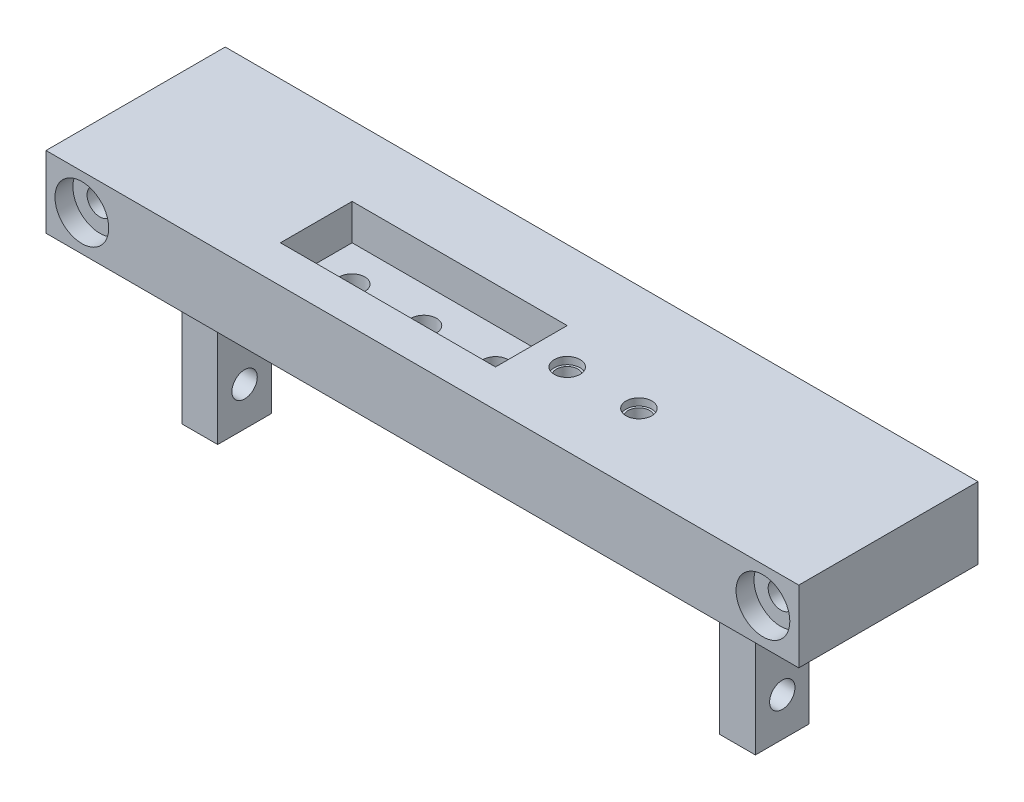
ISO-10303-21;
HEADER;
FILE_DESCRIPTION(('STEP AP214'),'2;1');
FILE_NAME('part.step','',(''),(''),'','','');
FILE_SCHEMA(('AUTOMOTIVE_DESIGN { 1 0 10303 214 1 1 1 1 }'));
ENDSEC;
DATA;
#1=APPLICATION_CONTEXT('core data for automotive mechanical design processes');
#2=APPLICATION_PROTOCOL_DEFINITION('international standard','automotive_design',2000,#1);
#3=PRODUCT_CONTEXT('',#1,'mechanical');
#4=PRODUCT('Part','Part','',(#3));
#5=PRODUCT_RELATED_PRODUCT_CATEGORY('part','',(#4));
#6=PRODUCT_DEFINITION_FORMATION('','',#4);
#7=PRODUCT_DEFINITION_CONTEXT('part definition',#1,'design');
#8=PRODUCT_DEFINITION('design','',#6,#7);
#9=PRODUCT_DEFINITION_SHAPE('','',#8);
#10=(LENGTH_UNIT() NAMED_UNIT(*) SI_UNIT(.MILLI.,.METRE.));
#11=(NAMED_UNIT(*) PLANE_ANGLE_UNIT() SI_UNIT($,.RADIAN.));
#12=(NAMED_UNIT(*) SI_UNIT($,.STERADIAN.) SOLID_ANGLE_UNIT());
#13=UNCERTAINTY_MEASURE_WITH_UNIT(LENGTH_MEASURE(1.E-05),#10,'distance_accuracy_value','');
#14=(GEOMETRIC_REPRESENTATION_CONTEXT(3) GLOBAL_UNCERTAINTY_ASSIGNED_CONTEXT((#13)) GLOBAL_UNIT_ASSIGNED_CONTEXT((#10,
#11,#12)) REPRESENTATION_CONTEXT('',''));
#15=CARTESIAN_POINT('',(0.,0.,0.));
#16=DIRECTION('',(0.,0.,1.));
#17=DIRECTION('',(1.,0.,0.));
#18=AXIS2_PLACEMENT_3D('',#15,#16,#17);
#19=CARTESIAN_POINT('',(66.675,12.7,-12.954));
#20=DIRECTION('',(0.,1.,0.));
#21=DIRECTION('',(0.,0.,1.));
#22=AXIS2_PLACEMENT_3D('',#19,#20,#21);
#23=CYLINDRICAL_SURFACE('',#22,2.24789999999999);
#24=CARTESIAN_POINT('',(66.675,0.,-12.954));
#25=DIRECTION('',(0.,1.,0.));
#26=DIRECTION('',(0.,0.,1.));
#27=AXIS2_PLACEMENT_3D('',#24,#25,#26);
#28=CIRCLE('',#27,2.2479);
#29=CARTESIAN_POINT('',(66.675,0.,-10.7061));
#30=VERTEX_POINT('',#29);
#31=EDGE_CURVE('E302',#30,#30,#28,.T.);
#32=ORIENTED_EDGE('',*,*,#31,.F.);
#33=EDGE_LOOP('',(#32));
#34=FACE_BOUND('',#33,.T.);
#35=CARTESIAN_POINT('',(66.675,6.35,-12.954));
#36=DIRECTION('',(0.,1.,0.));
#37=DIRECTION('',(0.,0.,1.));
#38=AXIS2_PLACEMENT_3D('',#35,#36,#37);
#39=CIRCLE('',#38,2.24789999999998);
#40=CARTESIAN_POINT('',(66.675,6.35,-10.7061));
#41=VERTEX_POINT('',#40);
#42=EDGE_CURVE('E169',#41,#41,#39,.F.);
#43=ORIENTED_EDGE('',*,*,#42,.F.);
#44=EDGE_LOOP('',(#43));
#45=FACE_BOUND('',#44,.T.);
#46=ADVANCED_FACE('F33',(#34,#45),#23,.F.);
#47=CARTESIAN_POINT('',(92.075,0.,-12.954));
#48=DIRECTION('',(0.,-1.,0.));
#49=DIRECTION('',(0.,0.,-1.));
#50=AXIS2_PLACEMENT_3D('',#47,#48,#49);
#51=CYLINDRICAL_SURFACE('',#50,1.89865);
#52=CARTESIAN_POINT('',(92.075,6.35,-12.954));
#53=DIRECTION('',(0.,-1.,0.));
#54=DIRECTION('',(0.,0.,-1.));
#55=AXIS2_PLACEMENT_3D('',#52,#53,#54);
#56=CIRCLE('',#55,1.89865);
#57=CARTESIAN_POINT('',(92.075,6.35,-14.85265));
#58=VERTEX_POINT('',#57);
#59=EDGE_CURVE('E221',#58,#58,#56,.T.);
#60=ORIENTED_EDGE('',*,*,#59,.T.);
#61=EDGE_LOOP('',(#60));
#62=FACE_BOUND('',#61,.T.);
#63=CARTESIAN_POINT('',(92.075,11.43,-12.954));
#64=DIRECTION('',(0.,1.,0.));
#65=DIRECTION('',(0.,0.,1.));
#66=AXIS2_PLACEMENT_3D('',#63,#64,#65);
#67=CIRCLE('',#66,1.89865);
#68=CARTESIAN_POINT('',(92.075,11.43,-11.05535));
#69=VERTEX_POINT('',#68);
#70=EDGE_CURVE('E209',#69,#69,#67,.F.);
#71=ORIENTED_EDGE('',*,*,#70,.F.);
#72=EDGE_LOOP('',(#71));
#73=FACE_BOUND('',#72,.T.);
#74=ADVANCED_FACE('F363',(#62,#73),#51,.F.);
#75=CARTESIAN_POINT('',(79.375,0.,-12.954));
#76=DIRECTION('',(0.,-1.,0.));
#77=DIRECTION('',(0.,0.,-1.));
#78=AXIS2_PLACEMENT_3D('',#75,#76,#77);
#79=CYLINDRICAL_SURFACE('',#78,1.89865);
#80=CARTESIAN_POINT('',(79.375,6.35,-12.954));
#81=DIRECTION('',(0.,-1.,0.));
#82=DIRECTION('',(0.,0.,-1.));
#83=AXIS2_PLACEMENT_3D('',#80,#81,#82);
#84=CIRCLE('',#83,1.89865);
#85=CARTESIAN_POINT('',(79.375,6.35,-14.85265));
#86=VERTEX_POINT('',#85);
#87=EDGE_CURVE('E212',#86,#86,#84,.T.);
#88=ORIENTED_EDGE('',*,*,#87,.T.);
#89=EDGE_LOOP('',(#88));
#90=FACE_BOUND('',#89,.T.);
#91=CARTESIAN_POINT('',(79.375,11.43,-12.954));
#92=DIRECTION('',(0.,1.,0.));
#93=DIRECTION('',(0.,0.,1.));
#94=AXIS2_PLACEMENT_3D('',#91,#92,#93);
#95=CIRCLE('',#94,1.89865);
#96=CARTESIAN_POINT('',(79.375,11.43,-11.05535));
#97=VERTEX_POINT('',#96);
#98=EDGE_CURVE('E196',#97,#97,#95,.F.);
#99=ORIENTED_EDGE('',*,*,#98,.F.);
#100=EDGE_LOOP('',(#99));
#101=FACE_BOUND('',#100,.T.);
#102=ADVANCED_FACE('F365',(#90,#101),#79,.F.);
#103=CARTESIAN_POINT('',(0.,0.,0.));
#104=DIRECTION('',(0.,-1.,0.));
#105=DIRECTION('',(0.,0.,-1.));
#106=AXIS2_PLACEMENT_3D('',#103,#104,#105);
#107=PLANE('',#106);
#108=CARTESIAN_POINT('',(53.975,0.,-12.954));
#109=DIRECTION('',(0.,-1.,0.));
#110=DIRECTION('',(0.,0.,-1.));
#111=AXIS2_PLACEMENT_3D('',#108,#109,#110);
#112=CIRCLE('',#111,2.2479);
#113=CARTESIAN_POINT('',(53.975,0.,-15.2019));
#114=VERTEX_POINT('',#113);
#115=EDGE_CURVE('E37',#114,#114,#112,.T.);
#116=ORIENTED_EDGE('',*,*,#115,.F.);
#117=EDGE_LOOP('',(#116));
#118=FACE_BOUND('',#117,.T.);
#119=CARTESIAN_POINT('',(41.275,0.,-12.954));
#120=DIRECTION('',(0.,-1.,0.));
#121=DIRECTION('',(0.,0.,-1.));
#122=AXIS2_PLACEMENT_3D('',#119,#120,#121);
#123=CIRCLE('',#122,2.2479);
#124=CARTESIAN_POINT('',(41.275,0.,-15.2019));
#125=VERTEX_POINT('',#124);
#126=EDGE_CURVE('E180',#125,#125,#123,.T.);
#127=ORIENTED_EDGE('',*,*,#126,.F.);
#128=EDGE_LOOP('',(#127));
#129=FACE_BOUND('',#128,.T.);
#130=CARTESIAN_POINT('',(79.375,0.,-12.954));
#131=DIRECTION('',(0.,-1.,0.));
#132=DIRECTION('',(0.,0.,-1.));
#133=AXIS2_PLACEMENT_3D('',#130,#131,#132);
#134=CIRCLE('',#133,3.96874999999999);
#135=CARTESIAN_POINT('',(79.375,0.,-16.92275));
#136=VERTEX_POINT('',#135);
#137=EDGE_CURVE('E205',#136,#136,#134,.T.);
#138=ORIENTED_EDGE('',*,*,#137,.F.);
#139=EDGE_LOOP('',(#138));
#140=FACE_BOUND('',#139,.T.);
#141=CARTESIAN_POINT('',(92.075,0.,-12.954));
#142=DIRECTION('',(0.,-1.,0.));
#143=DIRECTION('',(0.,0.,-1.));
#144=AXIS2_PLACEMENT_3D('',#141,#142,#143);
#145=CIRCLE('',#144,3.96875000000001);
#146=CARTESIAN_POINT('',(92.075,0.,-16.92275));
#147=VERTEX_POINT('',#146);
#148=EDGE_CURVE('E215',#147,#147,#145,.T.);
#149=ORIENTED_EDGE('',*,*,#148,.F.);
#150=EDGE_LOOP('',(#149));
#151=FACE_BOUND('',#150,.T.);
#152=ORIENTED_EDGE('',*,*,#31,.T.);
#153=EDGE_LOOP('',(#152));
#154=FACE_BOUND('',#153,.T.);
#155=DIRECTION('',(0.,0.,1.));
#156=VECTOR('',#155,1.);
#157=CARTESIAN_POINT('',(0.,0.,0.));
#158=LINE('',#157,#156);
#159=CARTESIAN_POINT('',(0.,0.,-31.75));
#160=VERTEX_POINT('',#159);
#161=CARTESIAN_POINT('',(0.,0.,0.));
#162=VERTEX_POINT('',#161);
#163=EDGE_CURVE('E329',#160,#162,#158,.T.);
#164=ORIENTED_EDGE('',*,*,#163,.F.);
#165=DIRECTION('',(-1.,0.,0.));
#166=VECTOR('',#165,1.);
#167=CARTESIAN_POINT('',(0.,0.,-31.75));
#168=LINE('',#167,#166);
#169=CARTESIAN_POINT('',(133.35,0.,-31.75));
#170=VERTEX_POINT('',#169);
#171=EDGE_CURVE('E334',#170,#160,#168,.T.);
#172=ORIENTED_EDGE('',*,*,#171,.F.);
#173=DIRECTION('',(0.,0.,-1.));
#174=VECTOR('',#173,1.);
#175=CARTESIAN_POINT('',(133.35,0.,0.));
#176=LINE('',#175,#174);
#177=CARTESIAN_POINT('',(133.35,0.,0.));
#178=VERTEX_POINT('',#177);
#179=EDGE_CURVE('E345',#178,#170,#176,.T.);
#180=ORIENTED_EDGE('',*,*,#179,.F.);
#181=DIRECTION('',(1.,0.,0.));
#182=VECTOR('',#181,1.);
#183=CARTESIAN_POINT('',(0.,0.,0.));
#184=LINE('',#183,#182);
#185=EDGE_CURVE('E343',#162,#178,#184,.T.);
#186=ORIENTED_EDGE('',*,*,#185,.F.);
#187=EDGE_LOOP('',(#164,#172,#180,#186));
#188=FACE_BOUND('',#187,.T.);
#189=DIRECTION('',(1.,0.,0.));
#190=VECTOR('',#189,1.);
#191=CARTESIAN_POINT('',(111.125,0.,-17.7165));
#192=LINE('',#191,#190);
#193=CARTESIAN_POINT('',(111.125,0.,-17.7165));
#194=VERTEX_POINT('',#193);
#195=CARTESIAN_POINT('',(117.475,0.,-17.7165));
#196=VERTEX_POINT('',#195);
#197=EDGE_CURVE('E287',#194,#196,#192,.T.);
#198=ORIENTED_EDGE('',*,*,#197,.F.);
#199=DIRECTION('',(0.,0.,-1.));
#200=VECTOR('',#199,1.);
#201=CARTESIAN_POINT('',(111.125,0.,-8.1915));
#202=LINE('',#201,#200);
#203=CARTESIAN_POINT('',(111.125,0.,-8.1915));
#204=VERTEX_POINT('',#203);
#205=EDGE_CURVE('E273',#204,#194,#202,.T.);
#206=ORIENTED_EDGE('',*,*,#205,.F.);
#207=DIRECTION('',(-1.,0.,0.));
#208=VECTOR('',#207,1.);
#209=CARTESIAN_POINT('',(111.125,0.,-8.1915));
#210=LINE('',#209,#208);
#211=CARTESIAN_POINT('',(117.475,0.,-8.1915));
#212=VERTEX_POINT('',#211);
#213=EDGE_CURVE('E278',#212,#204,#210,.T.);
#214=ORIENTED_EDGE('',*,*,#213,.F.);
#215=DIRECTION('',(0.,0.,1.));
#216=VECTOR('',#215,1.);
#217=CARTESIAN_POINT('',(117.475,0.,-8.1915));
#218=LINE('',#217,#216);
#219=EDGE_CURVE('E289',#196,#212,#218,.T.);
#220=ORIENTED_EDGE('',*,*,#219,.F.);
#221=EDGE_LOOP('',(#198,#206,#214,#220));
#222=FACE_BOUND('',#221,.T.);
#223=DIRECTION('',(1.,0.,0.));
#224=VECTOR('',#223,1.);
#225=CARTESIAN_POINT('',(15.875,0.,-17.7165));
#226=LINE('',#225,#224);
#227=CARTESIAN_POINT('',(15.875,0.,-17.7165));
#228=VERTEX_POINT('',#227);
#229=CARTESIAN_POINT('',(22.225,0.,-17.7165));
#230=VERTEX_POINT('',#229);
#231=EDGE_CURVE('E260',#228,#230,#226,.T.);
#232=ORIENTED_EDGE('',*,*,#231,.F.);
#233=DIRECTION('',(0.,0.,-1.));
#234=VECTOR('',#233,1.);
#235=CARTESIAN_POINT('',(15.875,0.,-8.1915));
#236=LINE('',#235,#234);
#237=CARTESIAN_POINT('',(15.875,0.,-8.1915));
#238=VERTEX_POINT('',#237);
#239=EDGE_CURVE('E246',#238,#228,#236,.T.);
#240=ORIENTED_EDGE('',*,*,#239,.F.);
#241=DIRECTION('',(-1.,0.,0.));
#242=VECTOR('',#241,1.);
#243=CARTESIAN_POINT('',(15.875,0.,-8.1915));
#244=LINE('',#243,#242);
#245=CARTESIAN_POINT('',(22.225,0.,-8.1915));
#246=VERTEX_POINT('',#245);
#247=EDGE_CURVE('E251',#246,#238,#244,.T.);
#248=ORIENTED_EDGE('',*,*,#247,.F.);
#249=DIRECTION('',(0.,0.,1.));
#250=VECTOR('',#249,1.);
#251=CARTESIAN_POINT('',(22.225,0.,-8.1915));
#252=LINE('',#251,#250);
#253=EDGE_CURVE('E262',#230,#246,#252,.T.);
#254=ORIENTED_EDGE('',*,*,#253,.F.);
#255=EDGE_LOOP('',(#232,#240,#248,#254));
#256=FACE_BOUND('',#255,.T.);
#257=ADVANCED_FACE('F372',(#118,#129,#140,#151,#154,#188,#222,#256),#107,.T.);
#258=CARTESIAN_POINT('',(0.,12.7,0.));
#259=DIRECTION('',(1.,0.,0.));
#260=DIRECTION('',(0.,0.,-1.));
#261=AXIS2_PLACEMENT_3D('',#258,#259,#260);
#262=PLANE('',#261);
#263=ORIENTED_EDGE('',*,*,#163,.T.);
#264=DIRECTION('',(0.,-1.,0.));
#265=VECTOR('',#264,1.);
#266=CARTESIAN_POINT('',(0.,12.7,0.));
#267=LINE('',#266,#265);
#268=CARTESIAN_POINT('',(0.,12.7,0.));
#269=VERTEX_POINT('',#268);
#270=EDGE_CURVE('E11',#269,#162,#267,.T.);
#271=ORIENTED_EDGE('',*,*,#270,.F.);
#272=DIRECTION('',(0.,0.,1.));
#273=VECTOR('',#272,1.);
#274=CARTESIAN_POINT('',(0.,12.7,0.));
#275=LINE('',#274,#273);
#276=CARTESIAN_POINT('',(0.,12.7,-31.75));
#277=VERTEX_POINT('',#276);
#278=EDGE_CURVE('E330',#277,#269,#275,.T.);
#279=ORIENTED_EDGE('',*,*,#278,.F.);
#280=DIRECTION('',(0.,-1.,0.));
#281=VECTOR('',#280,1.);
#282=CARTESIAN_POINT('',(0.,12.7,-31.75));
#283=LINE('',#282,#281);
#284=EDGE_CURVE('E340',#277,#160,#283,.T.);
#285=ORIENTED_EDGE('',*,*,#284,.T.);
#286=EDGE_LOOP('',(#263,#271,#279,#285));
#287=FACE_BOUND('',#286,.T.);
#288=ADVANCED_FACE('F35',(#287),#262,.F.);
#289=CARTESIAN_POINT('',(0.,12.7,0.));
#290=DIRECTION('',(0.,0.,-1.));
#291=DIRECTION('',(-1.,0.,0.));
#292=AXIS2_PLACEMENT_3D('',#289,#290,#291);
#293=PLANE('',#292);
#294=CARTESIAN_POINT('',(6.35,6.35,0.));
#295=DIRECTION('',(0.,0.,1.));
#296=DIRECTION('',(1.,0.,0.));
#297=AXIS2_PLACEMENT_3D('',#294,#295,#296);
#298=CIRCLE('',#297,4.76249999999999);
#299=CARTESIAN_POINT('',(11.1125,6.35,0.));
#300=VERTEX_POINT('',#299);
#301=EDGE_CURVE('E305',#300,#300,#298,.T.);
#302=ORIENTED_EDGE('',*,*,#301,.F.);
#303=EDGE_LOOP('',(#302));
#304=FACE_BOUND('',#303,.T.);
#305=CARTESIAN_POINT('',(127.,6.35,0.));
#306=DIRECTION('',(0.,0.,1.));
#307=DIRECTION('',(1.,0.,0.));
#308=AXIS2_PLACEMENT_3D('',#305,#306,#307);
#309=CIRCLE('',#308,4.7625);
#310=CARTESIAN_POINT('',(131.7625,6.35,0.));
#311=VERTEX_POINT('',#310);
#312=EDGE_CURVE('E317',#311,#311,#309,.T.);
#313=ORIENTED_EDGE('',*,*,#312,.F.);
#314=EDGE_LOOP('',(#313));
#315=FACE_BOUND('',#314,.T.);
#316=ORIENTED_EDGE('',*,*,#185,.T.);
#317=DIRECTION('',(0.,-1.,0.));
#318=VECTOR('',#317,1.);
#319=CARTESIAN_POINT('',(133.35,12.7,0.));
#320=LINE('',#319,#318);
#321=CARTESIAN_POINT('',(133.35,12.7,0.));
#322=VERTEX_POINT('',#321);
#323=EDGE_CURVE('E42',#322,#178,#320,.T.);
#324=ORIENTED_EDGE('',*,*,#323,.F.);
#325=DIRECTION('',(1.,0.,0.));
#326=VECTOR('',#325,1.);
#327=CARTESIAN_POINT('',(0.,12.7,0.));
#328=LINE('',#327,#326);
#329=EDGE_CURVE('E333',#269,#322,#328,.T.);
#330=ORIENTED_EDGE('',*,*,#329,.F.);
#331=ORIENTED_EDGE('',*,*,#270,.T.);
#332=EDGE_LOOP('',(#316,#324,#330,#331));
#333=FACE_BOUND('',#332,.T.);
#334=ADVANCED_FACE('F468',(#304,#315,#333),#293,.F.);
#335=CARTESIAN_POINT('',(133.35,12.7,0.));
#336=DIRECTION('',(-1.,0.,0.));
#337=DIRECTION('',(0.,0.,1.));
#338=AXIS2_PLACEMENT_3D('',#335,#336,#337);
#339=PLANE('',#338);
#340=ORIENTED_EDGE('',*,*,#179,.T.);
#341=DIRECTION('',(0.,-1.,0.));
#342=VECTOR('',#341,1.);
#343=CARTESIAN_POINT('',(133.35,12.7,-31.75));
#344=LINE('',#343,#342);
#345=CARTESIAN_POINT('',(133.35,12.7,-31.75));
#346=VERTEX_POINT('',#345);
#347=EDGE_CURVE('E350',#346,#170,#344,.T.);
#348=ORIENTED_EDGE('',*,*,#347,.F.);
#349=DIRECTION('',(0.,0.,-1.));
#350=VECTOR('',#349,1.);
#351=CARTESIAN_POINT('',(133.35,12.7,0.));
#352=LINE('',#351,#350);
#353=EDGE_CURVE('E336',#322,#346,#352,.T.);
#354=ORIENTED_EDGE('',*,*,#353,.F.);
#355=ORIENTED_EDGE('',*,*,#323,.T.);
#356=EDGE_LOOP('',(#340,#348,#354,#355));
#357=FACE_BOUND('',#356,.T.);
#358=ADVANCED_FACE('F465',(#357),#339,.F.);
#359=CARTESIAN_POINT('',(0.,12.7,-31.75));
#360=DIRECTION('',(0.,0.,1.));
#361=DIRECTION('',(1.,0.,0.));
#362=AXIS2_PLACEMENT_3D('',#359,#360,#361);
#363=PLANE('',#362);
#364=CARTESIAN_POINT('',(6.35,6.35,-31.75));
#365=DIRECTION('',(0.,0.,1.));
#366=DIRECTION('',(1.,0.,0.));
#367=AXIS2_PLACEMENT_3D('',#364,#365,#366);
#368=CIRCLE('',#367,2.24789999999999);
#369=CARTESIAN_POINT('',(8.59789999999999,6.35,-31.75));
#370=VERTEX_POINT('',#369);
#371=EDGE_CURVE('E314',#370,#370,#368,.T.);
#372=ORIENTED_EDGE('',*,*,#371,.T.);
#373=EDGE_LOOP('',(#372));
#374=FACE_BOUND('',#373,.T.);
#375=CARTESIAN_POINT('',(127.,6.35,-31.75));
#376=DIRECTION('',(0.,0.,1.));
#377=DIRECTION('',(1.,0.,0.));
#378=AXIS2_PLACEMENT_3D('',#375,#376,#377);
#379=CIRCLE('',#378,2.2479);
#380=CARTESIAN_POINT('',(129.2479,6.35,-31.75));
#381=VERTEX_POINT('',#380);
#382=EDGE_CURVE('E326',#381,#381,#379,.T.);
#383=ORIENTED_EDGE('',*,*,#382,.T.);
#384=EDGE_LOOP('',(#383));
#385=FACE_BOUND('',#384,.T.);
#386=ORIENTED_EDGE('',*,*,#171,.T.);
#387=ORIENTED_EDGE('',*,*,#284,.F.);
#388=DIRECTION('',(-1.,0.,0.));
#389=VECTOR('',#388,1.);
#390=CARTESIAN_POINT('',(0.,12.7,-31.75));
#391=LINE('',#390,#389);
#392=EDGE_CURVE('E338',#346,#277,#391,.T.);
#393=ORIENTED_EDGE('',*,*,#392,.F.);
#394=ORIENTED_EDGE('',*,*,#347,.T.);
#395=EDGE_LOOP('',(#386,#387,#393,#394));
#396=FACE_BOUND('',#395,.T.);
#397=ADVANCED_FACE('F458',(#374,#385,#396),#363,.F.);
#398=CARTESIAN_POINT('',(0.,12.7,0.));
#399=DIRECTION('',(0.,-1.,0.));
#400=DIRECTION('',(0.,0.,-1.));
#401=AXIS2_PLACEMENT_3D('',#398,#399,#400);
#402=PLANE('',#401);
#403=DIRECTION('',(0.,0.,1.));
#404=VECTOR('',#403,1.);
#405=CARTESIAN_POINT('',(73.025,12.7,0.));
#406=LINE('',#405,#404);
#407=CARTESIAN_POINT('',(73.025,12.7,-19.304));
#408=VERTEX_POINT('',#407);
#409=CARTESIAN_POINT('',(73.025,12.7,-6.604));
#410=VERTEX_POINT('',#409);
#411=EDGE_CURVE('E179',#408,#410,#406,.T.);
#412=ORIENTED_EDGE('',*,*,#411,.T.);
#413=DIRECTION('',(1.,0.,0.));
#414=VECTOR('',#413,1.);
#415=CARTESIAN_POINT('',(0.,12.7,-6.604));
#416=LINE('',#415,#414);
#417=CARTESIAN_POINT('',(34.925,12.7,-6.604));
#418=VERTEX_POINT('',#417);
#419=EDGE_CURVE('E50',#418,#410,#416,.T.);
#420=ORIENTED_EDGE('',*,*,#419,.F.);
#421=DIRECTION('',(0.,0.,1.));
#422=VECTOR('',#421,1.);
#423=CARTESIAN_POINT('',(34.925,12.7,0.));
#424=LINE('',#423,#422);
#425=CARTESIAN_POINT('',(34.925,12.7,-19.304));
#426=VERTEX_POINT('',#425);
#427=EDGE_CURVE('E172',#426,#418,#424,.T.);
#428=ORIENTED_EDGE('',*,*,#427,.F.);
#429=DIRECTION('',(-1.,0.,0.));
#430=VECTOR('',#429,1.);
#431=CARTESIAN_POINT('',(0.,12.7,-19.304));
#432=LINE('',#431,#430);
#433=EDGE_CURVE('E182',#408,#426,#432,.T.);
#434=ORIENTED_EDGE('',*,*,#433,.F.);
#435=EDGE_LOOP('',(#412,#420,#428,#434));
#436=FACE_BOUND('',#435,.T.);
#437=CARTESIAN_POINT('',(79.375,12.7,-12.954));
#438=DIRECTION('',(0.,1.,0.));
#439=DIRECTION('',(0.,0.,1.));
#440=AXIS2_PLACEMENT_3D('',#437,#438,#439);
#441=CIRCLE('',#440,2.28599999999999);
#442=CARTESIAN_POINT('',(79.375,12.7,-10.668));
#443=VERTEX_POINT('',#442);
#444=EDGE_CURVE('E197',#443,#443,#441,.T.);
#445=ORIENTED_EDGE('',*,*,#444,.F.);
#446=EDGE_LOOP('',(#445));
#447=FACE_BOUND('',#446,.T.);
#448=CARTESIAN_POINT('',(92.075,12.7,-12.954));
#449=DIRECTION('',(0.,1.,0.));
#450=DIRECTION('',(0.,0.,1.));
#451=AXIS2_PLACEMENT_3D('',#448,#449,#450);
#452=CIRCLE('',#451,2.28599999999999);
#453=CARTESIAN_POINT('',(92.075,12.7,-10.668));
#454=VERTEX_POINT('',#453);
#455=EDGE_CURVE('E189',#454,#454,#452,.T.);
#456=ORIENTED_EDGE('',*,*,#455,.F.);
#457=EDGE_LOOP('',(#456));
#458=FACE_BOUND('',#457,.T.);
#459=ORIENTED_EDGE('',*,*,#278,.T.);
#460=ORIENTED_EDGE('',*,*,#329,.T.);
#461=ORIENTED_EDGE('',*,*,#353,.T.);
#462=ORIENTED_EDGE('',*,*,#392,.T.);
#463=EDGE_LOOP('',(#459,#460,#461,#462));
#464=FACE_BOUND('',#463,.T.);
#465=ADVANCED_FACE('F454',(#436,#447,#458,#464),#402,.F.);
#466=CARTESIAN_POINT('',(127.,6.35,0.));
#467=DIRECTION('',(0.,0.,1.));
#468=DIRECTION('',(1.,0.,0.));
#469=AXIS2_PLACEMENT_3D('',#466,#467,#468);
#470=CYLINDRICAL_SURFACE('',#469,2.2479);
#471=ORIENTED_EDGE('',*,*,#382,.F.);
#472=EDGE_LOOP('',(#471));
#473=FACE_BOUND('',#472,.T.);
#474=CARTESIAN_POINT('',(127.,6.35,-3.175));
#475=DIRECTION('',(0.,0.,1.));
#476=DIRECTION('',(1.,0.,0.));
#477=AXIS2_PLACEMENT_3D('',#474,#475,#476);
#478=CIRCLE('',#477,2.2479);
#479=CARTESIAN_POINT('',(129.2479,6.35,-3.175));
#480=VERTEX_POINT('',#479);
#481=EDGE_CURVE('E323',#480,#480,#478,.T.);
#482=ORIENTED_EDGE('',*,*,#481,.T.);
#483=EDGE_LOOP('',(#482));
#484=FACE_BOUND('',#483,.T.);
#485=ADVANCED_FACE('F450',(#473,#484),#470,.F.);
#486=CARTESIAN_POINT('',(129.2479,6.35,-3.175));
#487=DIRECTION('',(0.,0.,-1.));
#488=DIRECTION('',(-1.,0.,0.));
#489=AXIS2_PLACEMENT_3D('',#486,#487,#488);
#490=PLANE('',#489);
#491=ORIENTED_EDGE('',*,*,#481,.F.);
#492=EDGE_LOOP('',(#491));
#493=FACE_BOUND('',#492,.T.);
#494=CARTESIAN_POINT('',(127.,6.35,-3.175));
#495=DIRECTION('',(0.,0.,1.));
#496=DIRECTION('',(1.,0.,0.));
#497=AXIS2_PLACEMENT_3D('',#494,#495,#496);
#498=CIRCLE('',#497,4.7625);
#499=CARTESIAN_POINT('',(131.7625,6.35,-3.175));
#500=VERTEX_POINT('',#499);
#501=EDGE_CURVE('E320',#500,#500,#498,.T.);
#502=ORIENTED_EDGE('',*,*,#501,.T.);
#503=EDGE_LOOP('',(#502));
#504=FACE_BOUND('',#503,.T.);
#505=ADVANCED_FACE('F446',(#493,#504),#490,.F.);
#506=CARTESIAN_POINT('',(127.,6.35,0.));
#507=DIRECTION('',(0.,0.,1.));
#508=DIRECTION('',(1.,0.,0.));
#509=AXIS2_PLACEMENT_3D('',#506,#507,#508);
#510=CYLINDRICAL_SURFACE('',#509,4.7625);
#511=ORIENTED_EDGE('',*,*,#501,.F.);
#512=EDGE_LOOP('',(#511));
#513=FACE_BOUND('',#512,.T.);
#514=ORIENTED_EDGE('',*,*,#312,.T.);
#515=EDGE_LOOP('',(#514));
#516=FACE_BOUND('',#515,.T.);
#517=ADVANCED_FACE('F442',(#513,#516),#510,.F.);
#518=CARTESIAN_POINT('',(6.35,6.35,0.));
#519=DIRECTION('',(0.,0.,1.));
#520=DIRECTION('',(1.,0.,0.));
#521=AXIS2_PLACEMENT_3D('',#518,#519,#520);
#522=CYLINDRICAL_SURFACE('',#521,2.24789999999999);
#523=ORIENTED_EDGE('',*,*,#371,.F.);
#524=EDGE_LOOP('',(#523));
#525=FACE_BOUND('',#524,.T.);
#526=CARTESIAN_POINT('',(6.35,6.35,-3.175));
#527=DIRECTION('',(0.,0.,1.));
#528=DIRECTION('',(1.,0.,0.));
#529=AXIS2_PLACEMENT_3D('',#526,#527,#528);
#530=CIRCLE('',#529,2.2479);
#531=CARTESIAN_POINT('',(8.5979,6.35,-3.175));
#532=VERTEX_POINT('',#531);
#533=EDGE_CURVE('E311',#532,#532,#530,.T.);
#534=ORIENTED_EDGE('',*,*,#533,.T.);
#535=EDGE_LOOP('',(#534));
#536=FACE_BOUND('',#535,.T.);
#537=ADVANCED_FACE('F438',(#525,#536),#522,.F.);
#538=CARTESIAN_POINT('',(8.5979,6.35,-3.175));
#539=DIRECTION('',(0.,0.,-1.));
#540=DIRECTION('',(-1.,0.,0.));
#541=AXIS2_PLACEMENT_3D('',#538,#539,#540);
#542=PLANE('',#541);
#543=ORIENTED_EDGE('',*,*,#533,.F.);
#544=EDGE_LOOP('',(#543));
#545=FACE_BOUND('',#544,.T.);
#546=CARTESIAN_POINT('',(6.35,6.35,-3.175));
#547=DIRECTION('',(0.,0.,1.));
#548=DIRECTION('',(1.,0.,0.));
#549=AXIS2_PLACEMENT_3D('',#546,#547,#548);
#550=CIRCLE('',#549,4.7625);
#551=CARTESIAN_POINT('',(11.1125,6.35,-3.175));
#552=VERTEX_POINT('',#551);
#553=EDGE_CURVE('E308',#552,#552,#550,.T.);
#554=ORIENTED_EDGE('',*,*,#553,.T.);
#555=EDGE_LOOP('',(#554));
#556=FACE_BOUND('',#555,.T.);
#557=ADVANCED_FACE('F434',(#545,#556),#542,.F.);
#558=CARTESIAN_POINT('',(6.35,6.35,0.));
#559=DIRECTION('',(0.,0.,1.));
#560=DIRECTION('',(1.,0.,0.));
#561=AXIS2_PLACEMENT_3D('',#558,#559,#560);
#562=CYLINDRICAL_SURFACE('',#561,4.76249999999999);
#563=ORIENTED_EDGE('',*,*,#553,.F.);
#564=EDGE_LOOP('',(#563));
#565=FACE_BOUND('',#564,.T.);
#566=ORIENTED_EDGE('',*,*,#301,.T.);
#567=EDGE_LOOP('',(#566));
#568=FACE_BOUND('',#567,.T.);
#569=ADVANCED_FACE('F429',(#565,#568),#562,.F.);
#570=CARTESIAN_POINT('',(111.125,-25.4,-8.1915));
#571=DIRECTION('',(1.,0.,0.));
#572=DIRECTION('',(0.,0.,-1.));
#573=AXIS2_PLACEMENT_3D('',#570,#571,#572);
#574=PLANE('',#573);
#575=CARTESIAN_POINT('',(111.125,-5.842,-12.954));
#576=DIRECTION('',(1.,0.,0.));
#577=DIRECTION('',(0.,0.,-1.));
#578=AXIS2_PLACEMENT_3D('',#575,#576,#577);
#579=CIRCLE('',#578,2.24789999999999);
#580=CARTESIAN_POINT('',(111.125,-5.842,-15.2019));
#581=VERTEX_POINT('',#580);
#582=EDGE_CURVE('E233',#581,#581,#579,.T.);
#583=ORIENTED_EDGE('',*,*,#582,.T.);
#584=EDGE_LOOP('',(#583));
#585=FACE_BOUND('',#584,.T.);
#586=CARTESIAN_POINT('',(111.125,-18.542,-12.954));
#587=DIRECTION('',(1.,0.,0.));
#588=DIRECTION('',(0.,0.,-1.));
#589=AXIS2_PLACEMENT_3D('',#586,#587,#588);
#590=CIRCLE('',#589,2.24789999999999);
#591=CARTESIAN_POINT('',(111.125,-18.542,-15.2019));
#592=VERTEX_POINT('',#591);
#593=EDGE_CURVE('E240',#592,#592,#590,.T.);
#594=ORIENTED_EDGE('',*,*,#593,.T.);
#595=EDGE_LOOP('',(#594));
#596=FACE_BOUND('',#595,.T.);
#597=ORIENTED_EDGE('',*,*,#205,.T.);
#598=DIRECTION('',(0.,1.,0.));
#599=VECTOR('',#598,1.);
#600=CARTESIAN_POINT('',(111.125,-25.4,-17.7165));
#601=LINE('',#600,#599);
#602=CARTESIAN_POINT('',(111.125,-25.4,-17.7165));
#603=VERTEX_POINT('',#602);
#604=EDGE_CURVE('E300',#603,#194,#601,.T.);
#605=ORIENTED_EDGE('',*,*,#604,.F.);
#606=DIRECTION('',(0.,0.,-1.));
#607=VECTOR('',#606,1.);
#608=CARTESIAN_POINT('',(111.125,-25.4,-8.1915));
#609=LINE('',#608,#607);
#610=CARTESIAN_POINT('',(111.125,-25.4,-8.1915));
#611=VERTEX_POINT('',#610);
#612=EDGE_CURVE('E274',#611,#603,#609,.T.);
#613=ORIENTED_EDGE('',*,*,#612,.F.);
#614=DIRECTION('',(0.,1.,0.));
#615=VECTOR('',#614,1.);
#616=CARTESIAN_POINT('',(111.125,-25.4,-8.1915));
#617=LINE('',#616,#615);
#618=EDGE_CURVE('E284',#611,#204,#617,.T.);
#619=ORIENTED_EDGE('',*,*,#618,.T.);
#620=EDGE_LOOP('',(#597,#605,#613,#619));
#621=FACE_BOUND('',#620,.T.);
#622=ADVANCED_FACE('F426',(#585,#596,#621),#574,.F.);
#623=CARTESIAN_POINT('',(111.125,-25.4,-17.7165));
#624=DIRECTION('',(0.,0.,1.));
#625=DIRECTION('',(1.,0.,0.));
#626=AXIS2_PLACEMENT_3D('',#623,#624,#625);
#627=PLANE('',#626);
#628=ORIENTED_EDGE('',*,*,#197,.T.);
#629=DIRECTION('',(0.,1.,0.));
#630=VECTOR('',#629,1.);
#631=CARTESIAN_POINT('',(117.475,-25.4,-17.7165));
#632=LINE('',#631,#630);
#633=CARTESIAN_POINT('',(117.475,-25.4,-17.7165));
#634=VERTEX_POINT('',#633);
#635=EDGE_CURVE('E297',#634,#196,#632,.T.);
#636=ORIENTED_EDGE('',*,*,#635,.F.);
#637=DIRECTION('',(1.,0.,0.));
#638=VECTOR('',#637,1.);
#639=CARTESIAN_POINT('',(111.125,-25.4,-17.7165));
#640=LINE('',#639,#638);
#641=EDGE_CURVE('E277',#603,#634,#640,.T.);
#642=ORIENTED_EDGE('',*,*,#641,.F.);
#643=ORIENTED_EDGE('',*,*,#604,.T.);
#644=EDGE_LOOP('',(#628,#636,#642,#643));
#645=FACE_BOUND('',#644,.T.);
#646=ADVANCED_FACE('F422',(#645),#627,.F.);
#647=CARTESIAN_POINT('',(117.475,-25.4,-8.1915));
#648=DIRECTION('',(-1.,0.,0.));
#649=DIRECTION('',(0.,0.,1.));
#650=AXIS2_PLACEMENT_3D('',#647,#648,#649);
#651=PLANE('',#650);
#652=CARTESIAN_POINT('',(117.475,-5.842,-12.954));
#653=DIRECTION('',(1.,0.,0.));
#654=DIRECTION('',(0.,0.,-1.));
#655=AXIS2_PLACEMENT_3D('',#652,#653,#654);
#656=CIRCLE('',#655,2.24789999999999);
#657=CARTESIAN_POINT('',(117.475,-5.842,-15.2019));
#658=VERTEX_POINT('',#657);
#659=EDGE_CURVE('E224',#658,#658,#656,.T.);
#660=ORIENTED_EDGE('',*,*,#659,.F.);
#661=EDGE_LOOP('',(#660));
#662=FACE_BOUND('',#661,.T.);
#663=CARTESIAN_POINT('',(117.475,-18.542,-12.954));
#664=DIRECTION('',(1.,0.,0.));
#665=DIRECTION('',(0.,0.,-1.));
#666=AXIS2_PLACEMENT_3D('',#663,#664,#665);
#667=CIRCLE('',#666,2.24789999999999);
#668=CARTESIAN_POINT('',(117.475,-18.542,-15.2019));
#669=VERTEX_POINT('',#668);
#670=EDGE_CURVE('E236',#669,#669,#667,.T.);
#671=ORIENTED_EDGE('',*,*,#670,.F.);
#672=EDGE_LOOP('',(#671));
#673=FACE_BOUND('',#672,.T.);
#674=ORIENTED_EDGE('',*,*,#219,.T.);
#675=DIRECTION('',(0.,1.,0.));
#676=VECTOR('',#675,1.);
#677=CARTESIAN_POINT('',(117.475,-25.4,-8.1915));
#678=LINE('',#677,#676);
#679=CARTESIAN_POINT('',(117.475,-25.4,-8.1915));
#680=VERTEX_POINT('',#679);
#681=EDGE_CURVE('E295',#680,#212,#678,.T.);
#682=ORIENTED_EDGE('',*,*,#681,.F.);
#683=DIRECTION('',(0.,0.,1.));
#684=VECTOR('',#683,1.);
#685=CARTESIAN_POINT('',(117.475,-25.4,-8.1915));
#686=LINE('',#685,#684);
#687=EDGE_CURVE('E280',#634,#680,#686,.T.);
#688=ORIENTED_EDGE('',*,*,#687,.F.);
#689=ORIENTED_EDGE('',*,*,#635,.T.);
#690=EDGE_LOOP('',(#674,#682,#688,#689));
#691=FACE_BOUND('',#690,.T.);
#692=ADVANCED_FACE('F418',(#662,#673,#691),#651,.F.);
#693=CARTESIAN_POINT('',(111.125,-25.4,-8.1915));
#694=DIRECTION('',(0.,0.,-1.));
#695=DIRECTION('',(-1.,0.,0.));
#696=AXIS2_PLACEMENT_3D('',#693,#694,#695);
#697=PLANE('',#696);
#698=ORIENTED_EDGE('',*,*,#213,.T.);
#699=ORIENTED_EDGE('',*,*,#618,.F.);
#700=DIRECTION('',(-1.,0.,0.));
#701=VECTOR('',#700,1.);
#702=CARTESIAN_POINT('',(111.125,-25.4,-8.1915));
#703=LINE('',#702,#701);
#704=EDGE_CURVE('E282',#680,#611,#703,.T.);
#705=ORIENTED_EDGE('',*,*,#704,.F.);
#706=ORIENTED_EDGE('',*,*,#681,.T.);
#707=EDGE_LOOP('',(#698,#699,#705,#706));
#708=FACE_BOUND('',#707,.T.);
#709=ADVANCED_FACE('F414',(#708),#697,.F.);
#710=CARTESIAN_POINT('',(0.,-25.4,0.));
#711=DIRECTION('',(0.,-1.,0.));
#712=DIRECTION('',(0.,0.,-1.));
#713=AXIS2_PLACEMENT_3D('',#710,#711,#712);
#714=PLANE('',#713);
#715=ORIENTED_EDGE('',*,*,#612,.T.);
#716=ORIENTED_EDGE('',*,*,#641,.T.);
#717=ORIENTED_EDGE('',*,*,#687,.T.);
#718=ORIENTED_EDGE('',*,*,#704,.T.);
#719=EDGE_LOOP('',(#715,#716,#717,#718));
#720=FACE_BOUND('',#719,.T.);
#721=ADVANCED_FACE('F410',(#720),#714,.T.);
#722=CARTESIAN_POINT('',(15.875,-25.4,-8.1915));
#723=DIRECTION('',(1.,0.,0.));
#724=DIRECTION('',(0.,0.,-1.));
#725=AXIS2_PLACEMENT_3D('',#722,#723,#724);
#726=PLANE('',#725);
#727=CARTESIAN_POINT('',(15.875,-5.842,-12.954));
#728=DIRECTION('',(1.,0.,0.));
#729=DIRECTION('',(0.,0.,-1.));
#730=AXIS2_PLACEMENT_3D('',#727,#728,#729);
#731=CIRCLE('',#730,2.24789999999999);
#732=CARTESIAN_POINT('',(15.875,-5.842,-15.2019));
#733=VERTEX_POINT('',#732);
#734=EDGE_CURVE('E230',#733,#733,#731,.T.);
#735=ORIENTED_EDGE('',*,*,#734,.T.);
#736=EDGE_LOOP('',(#735));
#737=FACE_BOUND('',#736,.T.);
#738=CARTESIAN_POINT('',(15.875,-18.542,-12.954));
#739=DIRECTION('',(1.,0.,0.));
#740=DIRECTION('',(0.,0.,-1.));
#741=AXIS2_PLACEMENT_3D('',#738,#739,#740);
#742=CIRCLE('',#741,2.24789999999999);
#743=CARTESIAN_POINT('',(15.875,-18.542,-15.2019));
#744=VERTEX_POINT('',#743);
#745=EDGE_CURVE('E239',#744,#744,#742,.T.);
#746=ORIENTED_EDGE('',*,*,#745,.T.);
#747=EDGE_LOOP('',(#746));
#748=FACE_BOUND('',#747,.T.);
#749=ORIENTED_EDGE('',*,*,#239,.T.);
#750=DIRECTION('',(0.,1.,0.));
#751=VECTOR('',#750,1.);
#752=CARTESIAN_POINT('',(15.875,-25.4,-17.7165));
#753=LINE('',#752,#751);
#754=CARTESIAN_POINT('',(15.875,-25.4,-17.7165));
#755=VERTEX_POINT('',#754);
#756=EDGE_CURVE('E271',#755,#228,#753,.T.);
#757=ORIENTED_EDGE('',*,*,#756,.F.);
#758=DIRECTION('',(0.,0.,-1.));
#759=VECTOR('',#758,1.);
#760=CARTESIAN_POINT('',(15.875,-25.4,-8.1915));
#761=LINE('',#760,#759);
#762=CARTESIAN_POINT('',(15.875,-25.4,-8.1915));
#763=VERTEX_POINT('',#762);
#764=EDGE_CURVE('E247',#763,#755,#761,.T.);
#765=ORIENTED_EDGE('',*,*,#764,.F.);
#766=DIRECTION('',(0.,1.,0.));
#767=VECTOR('',#766,1.);
#768=CARTESIAN_POINT('',(15.875,-25.4,-8.1915));
#769=LINE('',#768,#767);
#770=EDGE_CURVE('E257',#763,#238,#769,.T.);
#771=ORIENTED_EDGE('',*,*,#770,.T.);
#772=EDGE_LOOP('',(#749,#757,#765,#771));
#773=FACE_BOUND('',#772,.T.);
#774=ADVANCED_FACE('F406',(#737,#748,#773),#726,.F.);
#775=CARTESIAN_POINT('',(15.875,-25.4,-17.7165));
#776=DIRECTION('',(0.,0.,1.));
#777=DIRECTION('',(1.,0.,0.));
#778=AXIS2_PLACEMENT_3D('',#775,#776,#777);
#779=PLANE('',#778);
#780=ORIENTED_EDGE('',*,*,#231,.T.);
#781=DIRECTION('',(0.,1.,0.));
#782=VECTOR('',#781,1.);
#783=CARTESIAN_POINT('',(22.225,-25.4,-17.7165));
#784=LINE('',#783,#782);
#785=CARTESIAN_POINT('',(22.225,-25.4,-17.7165));
#786=VERTEX_POINT('',#785);
#787=EDGE_CURVE('E268',#786,#230,#784,.T.);
#788=ORIENTED_EDGE('',*,*,#787,.F.);
#789=DIRECTION('',(1.,0.,0.));
#790=VECTOR('',#789,1.);
#791=CARTESIAN_POINT('',(15.875,-25.4,-17.7165));
#792=LINE('',#791,#790);
#793=EDGE_CURVE('E250',#755,#786,#792,.T.);
#794=ORIENTED_EDGE('',*,*,#793,.F.);
#795=ORIENTED_EDGE('',*,*,#756,.T.);
#796=EDGE_LOOP('',(#780,#788,#794,#795));
#797=FACE_BOUND('',#796,.T.);
#798=ADVANCED_FACE('F402',(#797),#779,.F.);
#799=CARTESIAN_POINT('',(22.225,-25.4,-8.1915));
#800=DIRECTION('',(-1.,0.,0.));
#801=DIRECTION('',(0.,0.,1.));
#802=AXIS2_PLACEMENT_3D('',#799,#800,#801);
#803=PLANE('',#802);
#804=CARTESIAN_POINT('',(22.225,-5.842,-12.954));
#805=DIRECTION('',(-1.,0.,0.));
#806=DIRECTION('',(0.,0.,1.));
#807=AXIS2_PLACEMENT_3D('',#804,#805,#806);
#808=CIRCLE('',#807,2.24789999999999);
#809=CARTESIAN_POINT('',(22.225,-5.842,-10.7061));
#810=VERTEX_POINT('',#809);
#811=EDGE_CURVE('E227',#810,#810,#808,.T.);
#812=ORIENTED_EDGE('',*,*,#811,.T.);
#813=EDGE_LOOP('',(#812));
#814=FACE_BOUND('',#813,.T.);
#815=CARTESIAN_POINT('',(22.225,-18.542,-12.954));
#816=DIRECTION('',(-1.,0.,0.));
#817=DIRECTION('',(0.,0.,1.));
#818=AXIS2_PLACEMENT_3D('',#815,#816,#817);
#819=CIRCLE('',#818,2.24789999999999);
#820=CARTESIAN_POINT('',(22.225,-18.542,-10.7061));
#821=VERTEX_POINT('',#820);
#822=EDGE_CURVE('E243',#821,#821,#819,.T.);
#823=ORIENTED_EDGE('',*,*,#822,.T.);
#824=EDGE_LOOP('',(#823));
#825=FACE_BOUND('',#824,.T.);
#826=ORIENTED_EDGE('',*,*,#253,.T.);
#827=DIRECTION('',(0.,1.,0.));
#828=VECTOR('',#827,1.);
#829=CARTESIAN_POINT('',(22.225,-25.4,-8.1915));
#830=LINE('',#829,#828);
#831=CARTESIAN_POINT('',(22.225,-25.4,-8.1915));
#832=VERTEX_POINT('',#831);
#833=EDGE_CURVE('E58',#832,#246,#830,.T.);
#834=ORIENTED_EDGE('',*,*,#833,.F.);
#835=DIRECTION('',(0.,0.,1.));
#836=VECTOR('',#835,1.);
#837=CARTESIAN_POINT('',(22.225,-25.4,-8.1915));
#838=LINE('',#837,#836);
#839=EDGE_CURVE('E253',#786,#832,#838,.T.);
#840=ORIENTED_EDGE('',*,*,#839,.F.);
#841=ORIENTED_EDGE('',*,*,#787,.T.);
#842=EDGE_LOOP('',(#826,#834,#840,#841));
#843=FACE_BOUND('',#842,.T.);
#844=ADVANCED_FACE('F399',(#814,#825,#843),#803,.F.);
#845=CARTESIAN_POINT('',(15.875,-25.4,-8.1915));
#846=DIRECTION('',(0.,0.,-1.));
#847=DIRECTION('',(-1.,0.,0.));
#848=AXIS2_PLACEMENT_3D('',#845,#846,#847);
#849=PLANE('',#848);
#850=ORIENTED_EDGE('',*,*,#247,.T.);
#851=ORIENTED_EDGE('',*,*,#770,.F.);
#852=DIRECTION('',(-1.,0.,0.));
#853=VECTOR('',#852,1.);
#854=CARTESIAN_POINT('',(15.875,-25.4,-8.1915));
#855=LINE('',#854,#853);
#856=EDGE_CURVE('E255',#832,#763,#855,.T.);
#857=ORIENTED_EDGE('',*,*,#856,.F.);
#858=ORIENTED_EDGE('',*,*,#833,.T.);
#859=EDGE_LOOP('',(#850,#851,#857,#858));
#860=FACE_BOUND('',#859,.T.);
#861=ADVANCED_FACE('F395',(#860),#849,.F.);
#862=CARTESIAN_POINT('',(0.,-25.4,0.));
#863=DIRECTION('',(0.,-1.,0.));
#864=DIRECTION('',(0.,0.,-1.));
#865=AXIS2_PLACEMENT_3D('',#862,#863,#864);
#866=PLANE('',#865);
#867=ORIENTED_EDGE('',*,*,#764,.T.);
#868=ORIENTED_EDGE('',*,*,#793,.T.);
#869=ORIENTED_EDGE('',*,*,#839,.T.);
#870=ORIENTED_EDGE('',*,*,#856,.T.);
#871=EDGE_LOOP('',(#867,#868,#869,#870));
#872=FACE_BOUND('',#871,.T.);
#873=ADVANCED_FACE('F391',(#872),#866,.T.);
#874=CARTESIAN_POINT('',(117.475,-18.542,-12.954));
#875=DIRECTION('',(1.,0.,0.));
#876=DIRECTION('',(0.,0.,-1.));
#877=AXIS2_PLACEMENT_3D('',#874,#875,#876);
#878=CYLINDRICAL_SURFACE('',#877,2.24789999999999);
#879=ORIENTED_EDGE('',*,*,#745,.F.);
#880=EDGE_LOOP('',(#879));
#881=FACE_BOUND('',#880,.T.);
#882=ORIENTED_EDGE('',*,*,#822,.F.);
#883=EDGE_LOOP('',(#882));
#884=FACE_BOUND('',#883,.T.);
#885=ADVANCED_FACE('F388',(#881,#884),#878,.F.);
#886=ORIENTED_EDGE('',*,*,#670,.T.);
#887=EDGE_LOOP('',(#886));
#888=FACE_BOUND('',#887,.T.);
#889=ORIENTED_EDGE('',*,*,#593,.F.);
#890=EDGE_LOOP('',(#889));
#891=FACE_BOUND('',#890,.T.);
#892=ADVANCED_FACE('F386',(#888,#891),#878,.F.);
#893=CARTESIAN_POINT('',(117.475,-5.842,-12.954));
#894=DIRECTION('',(1.,0.,0.));
#895=DIRECTION('',(0.,0.,-1.));
#896=AXIS2_PLACEMENT_3D('',#893,#894,#895);
#897=CYLINDRICAL_SURFACE('',#896,2.24789999999999);
#898=ORIENTED_EDGE('',*,*,#659,.T.);
#899=EDGE_LOOP('',(#898));
#900=FACE_BOUND('',#899,.T.);
#901=ORIENTED_EDGE('',*,*,#582,.F.);
#902=EDGE_LOOP('',(#901));
#903=FACE_BOUND('',#902,.T.);
#904=ADVANCED_FACE('F382',(#900,#903),#897,.F.);
#905=ORIENTED_EDGE('',*,*,#811,.F.);
#906=EDGE_LOOP('',(#905));
#907=FACE_BOUND('',#906,.T.);
#908=ORIENTED_EDGE('',*,*,#734,.F.);
#909=EDGE_LOOP('',(#908));
#910=FACE_BOUND('',#909,.T.);
#911=ADVANCED_FACE('F385',(#907,#910),#897,.F.);
#912=CARTESIAN_POINT('',(93.97365,6.35,-12.954));
#913=DIRECTION('',(0.,1.,0.));
#914=DIRECTION('',(0.,0.,1.));
#915=AXIS2_PLACEMENT_3D('',#912,#913,#914);
#916=PLANE('',#915);
#917=ORIENTED_EDGE('',*,*,#59,.F.);
#918=EDGE_LOOP('',(#917));
#919=FACE_BOUND('',#918,.T.);
#920=CARTESIAN_POINT('',(92.075,6.35,-12.954));
#921=DIRECTION('',(0.,-1.,0.));
#922=DIRECTION('',(0.,0.,-1.));
#923=AXIS2_PLACEMENT_3D('',#920,#921,#922);
#924=CIRCLE('',#923,3.96875000000001);
#925=CARTESIAN_POINT('',(92.075,6.35,-16.92275));
#926=VERTEX_POINT('',#925);
#927=EDGE_CURVE('E218',#926,#926,#924,.T.);
#928=ORIENTED_EDGE('',*,*,#927,.T.);
#929=EDGE_LOOP('',(#928));
#930=FACE_BOUND('',#929,.T.);
#931=ADVANCED_FACE('F380',(#919,#930),#916,.F.);
#932=CARTESIAN_POINT('',(92.075,0.,-12.954));
#933=DIRECTION('',(0.,-1.,0.));
#934=DIRECTION('',(0.,0.,-1.));
#935=AXIS2_PLACEMENT_3D('',#932,#933,#934);
#936=CYLINDRICAL_SURFACE('',#935,3.96875000000001);
#937=ORIENTED_EDGE('',*,*,#927,.F.);
#938=EDGE_LOOP('',(#937));
#939=FACE_BOUND('',#938,.T.);
#940=ORIENTED_EDGE('',*,*,#148,.T.);
#941=EDGE_LOOP('',(#940));
#942=FACE_BOUND('',#941,.T.);
#943=ADVANCED_FACE('F676',(#939,#942),#936,.F.);
#944=CARTESIAN_POINT('',(81.27365,6.35,-12.954));
#945=DIRECTION('',(0.,1.,0.));
#946=DIRECTION('',(0.,0.,1.));
#947=AXIS2_PLACEMENT_3D('',#944,#945,#946);
#948=PLANE('',#947);
#949=ORIENTED_EDGE('',*,*,#87,.F.);
#950=EDGE_LOOP('',(#949));
#951=FACE_BOUND('',#950,.T.);
#952=CARTESIAN_POINT('',(79.375,6.35,-12.954));
#953=DIRECTION('',(0.,-1.,0.));
#954=DIRECTION('',(0.,0.,-1.));
#955=AXIS2_PLACEMENT_3D('',#952,#953,#954);
#956=CIRCLE('',#955,3.96874999999999);
#957=CARTESIAN_POINT('',(79.375,6.35,-16.92275));
#958=VERTEX_POINT('',#957);
#959=EDGE_CURVE('E208',#958,#958,#956,.T.);
#960=ORIENTED_EDGE('',*,*,#959,.T.);
#961=EDGE_LOOP('',(#960));
#962=FACE_BOUND('',#961,.T.);
#963=ADVANCED_FACE('F685',(#951,#962),#948,.F.);
#964=CARTESIAN_POINT('',(79.375,0.,-12.954));
#965=DIRECTION('',(0.,-1.,0.));
#966=DIRECTION('',(0.,0.,-1.));
#967=AXIS2_PLACEMENT_3D('',#964,#965,#966);
#968=CYLINDRICAL_SURFACE('',#967,3.96874999999999);
#969=ORIENTED_EDGE('',*,*,#959,.F.);
#970=EDGE_LOOP('',(#969));
#971=FACE_BOUND('',#970,.T.);
#972=ORIENTED_EDGE('',*,*,#137,.T.);
#973=EDGE_LOOP('',(#972));
#974=FACE_BOUND('',#973,.T.);
#975=ADVANCED_FACE('F694',(#971,#974),#968,.F.);
#976=CARTESIAN_POINT('',(79.375,11.43,-12.954));
#977=DIRECTION('',(0.,1.,0.));
#978=DIRECTION('',(0.,0.,1.));
#979=AXIS2_PLACEMENT_3D('',#976,#977,#978);
#980=PLANE('',#979);
#981=CARTESIAN_POINT('',(79.375,11.43,-12.954));
#982=DIRECTION('',(0.,1.,0.));
#983=DIRECTION('',(0.,0.,1.));
#984=AXIS2_PLACEMENT_3D('',#981,#982,#983);
#985=CIRCLE('',#984,2.28599999999999);
#986=CARTESIAN_POINT('',(79.375,11.43,-10.668));
#987=VERTEX_POINT('',#986);
#988=EDGE_CURVE('E193',#987,#987,#985,.T.);
#989=ORIENTED_EDGE('',*,*,#988,.T.);
#990=EDGE_LOOP('',(#989));
#991=FACE_BOUND('',#990,.T.);
#992=ORIENTED_EDGE('',*,*,#98,.T.);
#993=EDGE_LOOP('',(#992));
#994=FACE_BOUND('',#993,.T.);
#995=ADVANCED_FACE('F703',(#991,#994),#980,.T.);
#996=CARTESIAN_POINT('',(79.375,11.43,-12.954));
#997=DIRECTION('',(0.,1.,0.));
#998=DIRECTION('',(0.,0.,1.));
#999=AXIS2_PLACEMENT_3D('',#996,#997,#998);
#1000=CYLINDRICAL_SURFACE('',#999,2.28599999999999);
#1001=ORIENTED_EDGE('',*,*,#988,.F.);
#1002=EDGE_LOOP('',(#1001));
#1003=FACE_BOUND('',#1002,.T.);
#1004=ORIENTED_EDGE('',*,*,#444,.T.);
#1005=EDGE_LOOP('',(#1004));
#1006=FACE_BOUND('',#1005,.T.);
#1007=ADVANCED_FACE('F724',(#1003,#1006),#1000,.F.);
#1008=CARTESIAN_POINT('',(92.075,11.43,-12.954));
#1009=DIRECTION('',(0.,1.,0.));
#1010=DIRECTION('',(0.,0.,1.));
#1011=AXIS2_PLACEMENT_3D('',#1008,#1009,#1010);
#1012=PLANE('',#1011);
#1013=CARTESIAN_POINT('',(92.075,11.43,-12.954));
#1014=DIRECTION('',(0.,1.,0.));
#1015=DIRECTION('',(0.,0.,1.));
#1016=AXIS2_PLACEMENT_3D('',#1013,#1014,#1015);
#1017=CIRCLE('',#1016,2.28599999999999);
#1018=CARTESIAN_POINT('',(92.075,11.43,-10.668));
#1019=VERTEX_POINT('',#1018);
#1020=EDGE_CURVE('E200',#1019,#1019,#1017,.T.);
#1021=ORIENTED_EDGE('',*,*,#1020,.T.);
#1022=EDGE_LOOP('',(#1021));
#1023=FACE_BOUND('',#1022,.T.);
#1024=ORIENTED_EDGE('',*,*,#70,.T.);
#1025=EDGE_LOOP('',(#1024));
#1026=FACE_BOUND('',#1025,.T.);
#1027=ADVANCED_FACE('F361',(#1023,#1026),#1012,.T.);
#1028=CARTESIAN_POINT('',(92.075,11.43,-12.954));
#1029=DIRECTION('',(0.,1.,0.));
#1030=DIRECTION('',(0.,0.,1.));
#1031=AXIS2_PLACEMENT_3D('',#1028,#1029,#1030);
#1032=CYLINDRICAL_SURFACE('',#1031,2.28599999999999);
#1033=ORIENTED_EDGE('',*,*,#1020,.F.);
#1034=EDGE_LOOP('',(#1033));
#1035=FACE_BOUND('',#1034,.T.);
#1036=ORIENTED_EDGE('',*,*,#455,.T.);
#1037=EDGE_LOOP('',(#1036));
#1038=FACE_BOUND('',#1037,.T.);
#1039=ADVANCED_FACE('F743',(#1035,#1038),#1032,.F.);
#1040=CARTESIAN_POINT('',(0.,6.35,-6.604));
#1041=DIRECTION('',(0.,0.,1.));
#1042=DIRECTION('',(1.,0.,0.));
#1043=AXIS2_PLACEMENT_3D('',#1040,#1041,#1042);
#1044=PLANE('',#1043);
#1045=ORIENTED_EDGE('',*,*,#419,.T.);
#1046=DIRECTION('',(0.,1.,0.));
#1047=VECTOR('',#1046,1.);
#1048=CARTESIAN_POINT('',(73.025,6.35,-6.604));
#1049=LINE('',#1048,#1047);
#1050=CARTESIAN_POINT('',(73.025,6.35,-6.604));
#1051=VERTEX_POINT('',#1050);
#1052=EDGE_CURVE('E152',#1051,#410,#1049,.T.);
#1053=ORIENTED_EDGE('',*,*,#1052,.F.);
#1054=DIRECTION('',(1.,0.,0.));
#1055=VECTOR('',#1054,1.);
#1056=CARTESIAN_POINT('',(0.,6.35,-6.604));
#1057=LINE('',#1056,#1055);
#1058=CARTESIAN_POINT('',(34.925,6.35,-6.604));
#1059=VERTEX_POINT('',#1058);
#1060=EDGE_CURVE('E160',#1059,#1051,#1057,.T.);
#1061=ORIENTED_EDGE('',*,*,#1060,.F.);
#1062=DIRECTION('',(0.,1.,0.));
#1063=VECTOR('',#1062,1.);
#1064=CARTESIAN_POINT('',(34.925,6.35,-6.604));
#1065=LINE('',#1064,#1063);
#1066=EDGE_CURVE('E187',#1059,#418,#1065,.T.);
#1067=ORIENTED_EDGE('',*,*,#1066,.T.);
#1068=EDGE_LOOP('',(#1045,#1053,#1061,#1067));
#1069=FACE_BOUND('',#1068,.T.);
#1070=ADVANCED_FACE('F163',(#1069),#1044,.F.);
#1071=CARTESIAN_POINT('',(34.925,6.35,0.));
#1072=DIRECTION('',(-1.,0.,0.));
#1073=DIRECTION('',(0.,0.,1.));
#1074=AXIS2_PLACEMENT_3D('',#1071,#1072,#1073);
#1075=PLANE('',#1074);
#1076=ORIENTED_EDGE('',*,*,#427,.T.);
#1077=ORIENTED_EDGE('',*,*,#1066,.F.);
#1078=DIRECTION('',(0.,0.,1.));
#1079=VECTOR('',#1078,1.);
#1080=CARTESIAN_POINT('',(34.925,6.35,0.));
#1081=LINE('',#1080,#1079);
#1082=CARTESIAN_POINT('',(34.925,6.35,-19.304));
#1083=VERTEX_POINT('',#1082);
#1084=EDGE_CURVE('E165',#1083,#1059,#1081,.T.);
#1085=ORIENTED_EDGE('',*,*,#1084,.F.);
#1086=DIRECTION('',(0.,1.,0.));
#1087=VECTOR('',#1086,1.);
#1088=CARTESIAN_POINT('',(34.925,6.35,-19.304));
#1089=LINE('',#1088,#1087);
#1090=EDGE_CURVE('E190',#1083,#426,#1089,.T.);
#1091=ORIENTED_EDGE('',*,*,#1090,.T.);
#1092=EDGE_LOOP('',(#1076,#1077,#1085,#1091));
#1093=FACE_BOUND('',#1092,.T.);
#1094=ADVANCED_FACE('F769',(#1093),#1075,.F.);
#1095=CARTESIAN_POINT('',(0.,6.35,-19.304));
#1096=DIRECTION('',(0.,0.,-1.));
#1097=DIRECTION('',(-1.,0.,0.));
#1098=AXIS2_PLACEMENT_3D('',#1095,#1096,#1097);
#1099=PLANE('',#1098);
#1100=ORIENTED_EDGE('',*,*,#433,.T.);
#1101=ORIENTED_EDGE('',*,*,#1090,.F.);
#1102=DIRECTION('',(-1.,0.,0.));
#1103=VECTOR('',#1102,1.);
#1104=CARTESIAN_POINT('',(0.,6.35,-19.304));
#1105=LINE('',#1104,#1103);
#1106=CARTESIAN_POINT('',(73.025,6.35,-19.304));
#1107=VERTEX_POINT('',#1106);
#1108=EDGE_CURVE('E159',#1107,#1083,#1105,.T.);
#1109=ORIENTED_EDGE('',*,*,#1108,.F.);
#1110=DIRECTION('',(0.,1.,0.));
#1111=VECTOR('',#1110,1.);
#1112=CARTESIAN_POINT('',(73.025,6.35,-19.304));
#1113=LINE('',#1112,#1111);
#1114=EDGE_CURVE('E154',#1107,#408,#1113,.T.);
#1115=ORIENTED_EDGE('',*,*,#1114,.T.);
#1116=EDGE_LOOP('',(#1100,#1101,#1109,#1115));
#1117=FACE_BOUND('',#1116,.T.);
#1118=ADVANCED_FACE('F778',(#1117),#1099,.F.);
#1119=CARTESIAN_POINT('',(73.025,6.35,0.));
#1120=DIRECTION('',(-1.,0.,0.));
#1121=DIRECTION('',(0.,0.,1.));
#1122=AXIS2_PLACEMENT_3D('',#1119,#1120,#1121);
#1123=PLANE('',#1122);
#1124=ORIENTED_EDGE('',*,*,#411,.F.);
#1125=ORIENTED_EDGE('',*,*,#1114,.F.);
#1126=DIRECTION('',(0.,0.,1.));
#1127=VECTOR('',#1126,1.);
#1128=CARTESIAN_POINT('',(73.025,6.35,0.));
#1129=LINE('',#1128,#1127);
#1130=EDGE_CURVE('E149',#1107,#1051,#1129,.T.);
#1131=ORIENTED_EDGE('',*,*,#1130,.T.);
#1132=ORIENTED_EDGE('',*,*,#1052,.T.);
#1133=EDGE_LOOP('',(#1124,#1125,#1131,#1132));
#1134=FACE_BOUND('',#1133,.T.);
#1135=ADVANCED_FACE('F151',(#1134),#1123,.T.);
#1136=CARTESIAN_POINT('',(0.,6.35,0.));
#1137=DIRECTION('',(0.,1.,0.));
#1138=DIRECTION('',(0.,0.,1.));
#1139=AXIS2_PLACEMENT_3D('',#1136,#1137,#1138);
#1140=PLANE('',#1139);
#1141=CARTESIAN_POINT('',(53.975,6.35,-12.954));
#1142=DIRECTION('',(0.,1.,0.));
#1143=DIRECTION('',(0.,0.,1.));
#1144=AXIS2_PLACEMENT_3D('',#1141,#1142,#1143);
#1145=CIRCLE('',#1144,2.2479);
#1146=CARTESIAN_POINT('',(53.975,6.35,-10.7061));
#1147=VERTEX_POINT('',#1146);
#1148=EDGE_CURVE('E838',#1147,#1147,#1145,.T.);
#1149=ORIENTED_EDGE('',*,*,#1148,.F.);
#1150=EDGE_LOOP('',(#1149));
#1151=FACE_BOUND('',#1150,.T.);
#1152=CARTESIAN_POINT('',(41.275,6.35,-12.954));
#1153=DIRECTION('',(0.,1.,0.));
#1154=DIRECTION('',(0.,0.,1.));
#1155=AXIS2_PLACEMENT_3D('',#1152,#1153,#1154);
#1156=CIRCLE('',#1155,2.2479);
#1157=CARTESIAN_POINT('',(41.275,6.35,-10.7061));
#1158=VERTEX_POINT('',#1157);
#1159=EDGE_CURVE('E840',#1158,#1158,#1156,.T.);
#1160=ORIENTED_EDGE('',*,*,#1159,.F.);
#1161=EDGE_LOOP('',(#1160));
#1162=FACE_BOUND('',#1161,.T.);
#1163=ORIENTED_EDGE('',*,*,#42,.T.);
#1164=EDGE_LOOP('',(#1163));
#1165=FACE_BOUND('',#1164,.T.);
#1166=ORIENTED_EDGE('',*,*,#1060,.T.);
#1167=ORIENTED_EDGE('',*,*,#1130,.F.);
#1168=ORIENTED_EDGE('',*,*,#1108,.T.);
#1169=ORIENTED_EDGE('',*,*,#1084,.T.);
#1170=EDGE_LOOP('',(#1166,#1167,#1168,#1169));
#1171=FACE_BOUND('',#1170,.T.);
#1172=ADVANCED_FACE('F167',(#1151,#1162,#1165,#1171),#1140,.T.);
#1173=CARTESIAN_POINT('',(41.275,6.35,-12.954));
#1174=DIRECTION('',(0.,1.,0.));
#1175=DIRECTION('',(0.,0.,1.));
#1176=AXIS2_PLACEMENT_3D('',#1173,#1174,#1175);
#1177=CYLINDRICAL_SURFACE('',#1176,2.2479);
#1178=ORIENTED_EDGE('',*,*,#126,.T.);
#1179=EDGE_LOOP('',(#1178));
#1180=FACE_BOUND('',#1179,.T.);
#1181=ORIENTED_EDGE('',*,*,#1159,.T.);
#1182=EDGE_LOOP('',(#1181));
#1183=FACE_BOUND('',#1182,.T.);
#1184=ADVANCED_FACE('F809',(#1180,#1183),#1177,.F.);
#1185=CARTESIAN_POINT('',(53.975,6.35,-12.954));
#1186=DIRECTION('',(0.,1.,0.));
#1187=DIRECTION('',(0.,0.,1.));
#1188=AXIS2_PLACEMENT_3D('',#1185,#1186,#1187);
#1189=CYLINDRICAL_SURFACE('',#1188,2.2479);
#1190=ORIENTED_EDGE('',*,*,#115,.T.);
#1191=EDGE_LOOP('',(#1190));
#1192=FACE_BOUND('',#1191,.T.);
#1193=ORIENTED_EDGE('',*,*,#1148,.T.);
#1194=EDGE_LOOP('',(#1193));
#1195=FACE_BOUND('',#1194,.T.);
#1196=ADVANCED_FACE('F819',(#1192,#1195),#1189,.F.);
#1197=CLOSED_SHELL('',(#46,#74,#102,#257,#288,#334,#358,#397,#465,#485,#505,#517,#537,#557,#569,
#622,#646,#692,#709,#721,#774,#798,#844,#861,#873,#885,#892,#904,#911,#931,#943,#963,#975,#995,
#1007,#1027,#1039,#1070,#1094,#1118,#1135,#1172,#1184,#1196));
#1198=MANIFOLD_SOLID_BREP('B2',#1197);
#1199=ADVANCED_BREP_SHAPE_REPRESENTATION('',(#18,#1198),#14);
#1200=SHAPE_DEFINITION_REPRESENTATION(#9,#1199);
ENDSEC;
END-ISO-10303-21;
